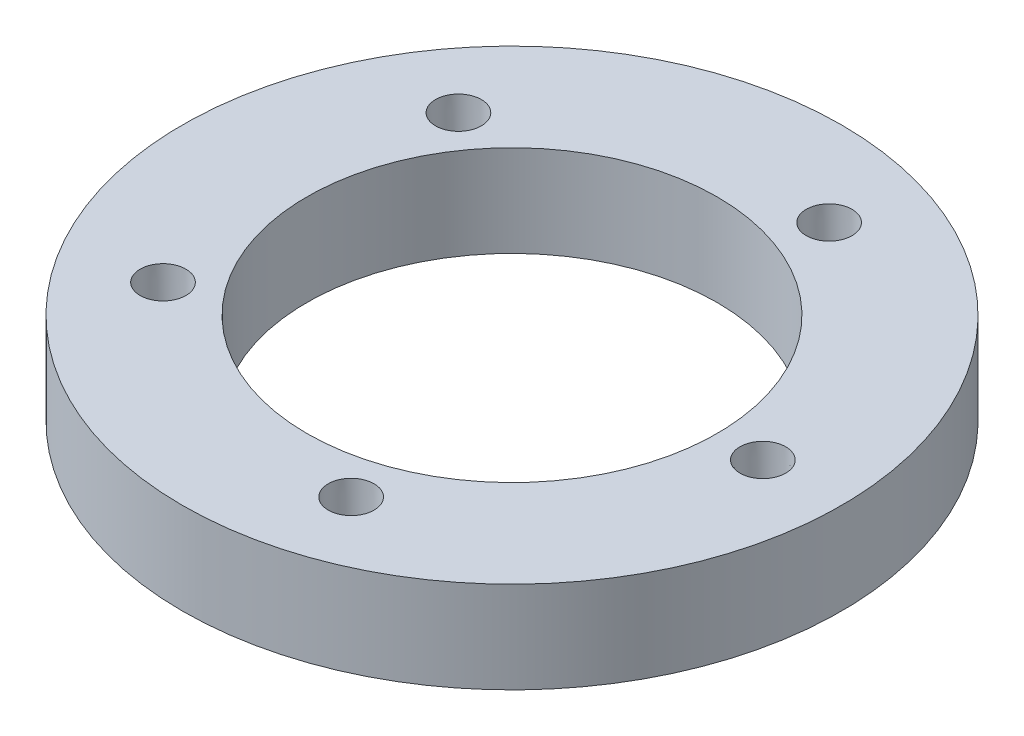
ISO-10303-21;
HEADER;
FILE_DESCRIPTION(('STEP AP214'),'2;1');
FILE_NAME('part.step','',(''),(''),'','','');
FILE_SCHEMA(('AUTOMOTIVE_DESIGN { 1 0 10303 214 1 1 1 1 }'));
ENDSEC;
DATA;
#1=APPLICATION_CONTEXT('core data for automotive mechanical design processes');
#2=APPLICATION_PROTOCOL_DEFINITION('international standard','automotive_design',2000,#1);
#3=PRODUCT_CONTEXT('',#1,'mechanical');
#4=PRODUCT('Part','Part','',(#3));
#5=PRODUCT_RELATED_PRODUCT_CATEGORY('part','',(#4));
#6=PRODUCT_DEFINITION_FORMATION('','',#4);
#7=PRODUCT_DEFINITION_CONTEXT('part definition',#1,'design');
#8=PRODUCT_DEFINITION('design','',#6,#7);
#9=PRODUCT_DEFINITION_SHAPE('','',#8);
#10=(LENGTH_UNIT() NAMED_UNIT(*) SI_UNIT(.MILLI.,.METRE.));
#11=(NAMED_UNIT(*) PLANE_ANGLE_UNIT() SI_UNIT($,.RADIAN.));
#12=(NAMED_UNIT(*) SI_UNIT($,.STERADIAN.) SOLID_ANGLE_UNIT());
#13=UNCERTAINTY_MEASURE_WITH_UNIT(LENGTH_MEASURE(1.E-05),#10,'distance_accuracy_value','');
#14=(GEOMETRIC_REPRESENTATION_CONTEXT(3) GLOBAL_UNCERTAINTY_ASSIGNED_CONTEXT((#13)) GLOBAL_UNIT_ASSIGNED_CONTEXT((#10,
#11,#12)) REPRESENTATION_CONTEXT('',''));
#15=CARTESIAN_POINT('',(0.,0.,0.));
#16=DIRECTION('',(0.,0.,1.));
#17=DIRECTION('',(1.,0.,0.));
#18=AXIS2_PLACEMENT_3D('',#15,#16,#17);
#19=CARTESIAN_POINT('',(0.,5.,0.));
#20=DIRECTION('',(0.,1.,0.));
#21=DIRECTION('',(0.,0.,1.));
#22=AXIS2_PLACEMENT_3D('',#19,#20,#21);
#23=PLANE('',#22);
#24=CARTESIAN_POINT('',(0.,5.,0.));
#25=DIRECTION('',(0.,1.,0.));
#26=DIRECTION('',(0.,0.,1.));
#27=AXIS2_PLACEMENT_3D('',#24,#25,#26);
#28=CIRCLE('',#27,18.);
#29=CARTESIAN_POINT('',(0.,5.,18.));
#30=VERTEX_POINT('',#29);
#31=EDGE_CURVE('E77',#30,#30,#28,.T.);
#32=ORIENTED_EDGE('',*,*,#31,.T.);
#33=EDGE_LOOP('',(#32));
#34=FACE_BOUND('',#33,.T.);
#35=CARTESIAN_POINT('',(0.,5.,0.));
#36=DIRECTION('',(0.,1.,0.));
#37=DIRECTION('',(0.,0.,1.));
#38=AXIS2_PLACEMENT_3D('',#35,#36,#37);
#39=CIRCLE('',#38,11.2);
#40=CARTESIAN_POINT('',(0.,5.,11.2));
#41=VERTEX_POINT('',#40);
#42=EDGE_CURVE('E10',#41,#41,#39,.T.);
#43=ORIENTED_EDGE('',*,*,#42,.F.);
#44=EDGE_LOOP('',(#43));
#45=FACE_BOUND('',#44,.T.);
#46=CARTESIAN_POINT('',(-11.0393221318819,5.,-8.11316010371688));
#47=DIRECTION('',(0.,1.,0.));
#48=DIRECTION('',(0.,0.,1.));
#49=AXIS2_PLACEMENT_3D('',#46,#47,#48);
#50=CIRCLE('',#49,1.25);
#51=CARTESIAN_POINT('',(-11.0393221318819,5.,-6.86316010371689));
#52=VERTEX_POINT('',#51);
#53=EDGE_CURVE('E49',#52,#52,#50,.T.);
#54=ORIENTED_EDGE('',*,*,#53,.F.);
#55=EDGE_LOOP('',(#54));
#56=FACE_BOUND('',#55,.T.);
#57=CARTESIAN_POINT('',(-11.0833278924611,5.,7.97772429884118));
#58=DIRECTION('',(0.,1.,0.));
#59=DIRECTION('',(0.,0.,1.));
#60=AXIS2_PLACEMENT_3D('',#57,#58,#59);
#61=CIRCLE('',#60,1.25);
#62=CARTESIAN_POINT('',(-11.0833278924611,5.,9.22772429884118));
#63=VERTEX_POINT('',#62);
#64=EDGE_CURVE('E70',#63,#63,#61,.T.);
#65=ORIENTED_EDGE('',*,*,#64,.F.);
#66=EDGE_LOOP('',(#65));
#67=FACE_BOUND('',#66,.T.);
#68=CARTESIAN_POINT('',(4.20641404367436,5.,12.9919329991078));
#69=DIRECTION('',(0.,1.,0.));
#70=DIRECTION('',(0.,0.,1.));
#71=AXIS2_PLACEMENT_3D('',#68,#69,#70);
#72=CIRCLE('',#71,1.25);
#73=CARTESIAN_POINT('',(4.20641404367436,5.,14.2419329991078));
#74=VERTEX_POINT('',#73);
#75=EDGE_CURVE('E64',#74,#74,#72,.T.);
#76=ORIENTED_EDGE('',*,*,#75,.F.);
#77=EDGE_LOOP('',(#76));
#78=FACE_BOUND('',#77,.T.);
#79=CARTESIAN_POINT('',(13.7,5.,0.));
#80=DIRECTION('',(0.,1.,0.));
#81=DIRECTION('',(0.,0.,1.));
#82=AXIS2_PLACEMENT_3D('',#79,#80,#81);
#83=CIRCLE('',#82,1.25);
#84=CARTESIAN_POINT('',(13.7,5.,1.25));
#85=VERTEX_POINT('',#84);
#86=EDGE_CURVE('E56',#85,#85,#83,.T.);
#87=ORIENTED_EDGE('',*,*,#86,.F.);
#88=EDGE_LOOP('',(#87));
#89=FACE_BOUND('',#88,.T.);
#90=CARTESIAN_POINT('',(4.27761685999241,5.,-13.0436648732767));
#91=DIRECTION('',(0.,1.,0.));
#92=DIRECTION('',(0.,0.,1.));
#93=AXIS2_PLACEMENT_3D('',#90,#91,#92);
#94=CIRCLE('',#93,1.25);
#95=CARTESIAN_POINT('',(4.27761685999241,5.,-11.7936648732767));
#96=VERTEX_POINT('',#95);
#97=EDGE_CURVE('E57',#96,#96,#94,.T.);
#98=ORIENTED_EDGE('',*,*,#97,.F.);
#99=EDGE_LOOP('',(#98));
#100=FACE_BOUND('',#99,.T.);
#101=ADVANCED_FACE('F34',(#34,#45,#56,#67,#78,#89,#100),#23,.T.);
#102=CARTESIAN_POINT('',(0.,0.,0.));
#103=DIRECTION('',(0.,1.,0.));
#104=DIRECTION('',(0.,0.,1.));
#105=AXIS2_PLACEMENT_3D('',#102,#103,#104);
#106=PLANE('',#105);
#107=CARTESIAN_POINT('',(0.,0.,0.));
#108=DIRECTION('',(0.,1.,0.));
#109=DIRECTION('',(0.,0.,1.));
#110=AXIS2_PLACEMENT_3D('',#107,#108,#109);
#111=CIRCLE('',#110,18.);
#112=CARTESIAN_POINT('',(0.,0.,18.));
#113=VERTEX_POINT('',#112);
#114=EDGE_CURVE('E60',#113,#113,#111,.F.);
#115=ORIENTED_EDGE('',*,*,#114,.T.);
#116=EDGE_LOOP('',(#115));
#117=FACE_BOUND('',#116,.T.);
#118=CARTESIAN_POINT('',(0.,0.,0.));
#119=DIRECTION('',(0.,1.,0.));
#120=DIRECTION('',(0.,0.,1.));
#121=AXIS2_PLACEMENT_3D('',#118,#119,#120);
#122=CIRCLE('',#121,11.2);
#123=CARTESIAN_POINT('',(0.,0.,11.2));
#124=VERTEX_POINT('',#123);
#125=EDGE_CURVE('E38',#124,#124,#122,.T.);
#126=ORIENTED_EDGE('',*,*,#125,.T.);
#127=EDGE_LOOP('',(#126));
#128=FACE_BOUND('',#127,.T.);
#129=CARTESIAN_POINT('',(-11.0393221318819,0.,-8.11316010371688));
#130=DIRECTION('',(0.,1.,0.));
#131=DIRECTION('',(0.,0.,1.));
#132=AXIS2_PLACEMENT_3D('',#129,#130,#131);
#133=CIRCLE('',#132,1.07539615254126);
#134=CARTESIAN_POINT('',(-11.0393221318819,0.,-7.03776395117563));
#135=VERTEX_POINT('',#134);
#136=EDGE_CURVE('E45',#135,#135,#133,.T.);
#137=ORIENTED_EDGE('',*,*,#136,.T.);
#138=EDGE_LOOP('',(#137));
#139=FACE_BOUND('',#138,.T.);
#140=CARTESIAN_POINT('',(-11.0833278924611,0.,7.97772429884118));
#141=DIRECTION('',(0.,1.,0.));
#142=DIRECTION('',(0.,0.,1.));
#143=AXIS2_PLACEMENT_3D('',#140,#141,#142);
#144=CIRCLE('',#143,1.07539615254126);
#145=CARTESIAN_POINT('',(-11.0833278924611,0.,9.05312045138244));
#146=VERTEX_POINT('',#145);
#147=EDGE_CURVE('E52',#146,#146,#144,.T.);
#148=ORIENTED_EDGE('',*,*,#147,.T.);
#149=EDGE_LOOP('',(#148));
#150=FACE_BOUND('',#149,.T.);
#151=CARTESIAN_POINT('',(4.20641404367436,0.,12.9919329991078));
#152=DIRECTION('',(0.,1.,0.));
#153=DIRECTION('',(0.,0.,1.));
#154=AXIS2_PLACEMENT_3D('',#151,#152,#153);
#155=CIRCLE('',#154,1.07539615254126);
#156=CARTESIAN_POINT('',(4.20641404367436,0.,14.0673291516491));
#157=VERTEX_POINT('',#156);
#158=EDGE_CURVE('E67',#157,#157,#155,.T.);
#159=ORIENTED_EDGE('',*,*,#158,.T.);
#160=EDGE_LOOP('',(#159));
#161=FACE_BOUND('',#160,.T.);
#162=CARTESIAN_POINT('',(13.7,0.,0.));
#163=DIRECTION('',(0.,1.,0.));
#164=DIRECTION('',(0.,0.,1.));
#165=AXIS2_PLACEMENT_3D('',#162,#163,#164);
#166=CIRCLE('',#165,1.07539615254126);
#167=CARTESIAN_POINT('',(13.7,0.,1.07539615254126));
#168=VERTEX_POINT('',#167);
#169=EDGE_CURVE('E61',#168,#168,#166,.T.);
#170=ORIENTED_EDGE('',*,*,#169,.T.);
#171=EDGE_LOOP('',(#170));
#172=FACE_BOUND('',#171,.T.);
#173=CARTESIAN_POINT('',(4.27761685999241,0.,-13.0436648732767));
#174=DIRECTION('',(0.,1.,0.));
#175=DIRECTION('',(0.,0.,1.));
#176=AXIS2_PLACEMENT_3D('',#173,#174,#175);
#177=CIRCLE('',#176,1.07539615254126);
#178=CARTESIAN_POINT('',(4.27761685999241,0.,-11.9682687207354));
#179=VERTEX_POINT('',#178);
#180=EDGE_CURVE('E53',#179,#179,#177,.T.);
#181=ORIENTED_EDGE('',*,*,#180,.T.);
#182=EDGE_LOOP('',(#181));
#183=FACE_BOUND('',#182,.T.);
#184=ADVANCED_FACE('F36',(#117,#128,#139,#150,#161,#172,#183),#106,.F.);
#185=CARTESIAN_POINT('',(0.,5.,0.));
#186=DIRECTION('',(0.,-1.,0.));
#187=DIRECTION('',(0.,0.,-1.));
#188=AXIS2_PLACEMENT_3D('',#185,#186,#187);
#189=CYLINDRICAL_SURFACE('',#188,11.2);
#190=ORIENTED_EDGE('',*,*,#42,.T.);
#191=EDGE_LOOP('',(#190));
#192=FACE_BOUND('',#191,.T.);
#193=ORIENTED_EDGE('',*,*,#125,.F.);
#194=EDGE_LOOP('',(#193));
#195=FACE_BOUND('',#194,.T.);
#196=ADVANCED_FACE('F122',(#192,#195),#189,.F.);
#197=CARTESIAN_POINT('',(-11.0393221318819,5.,-8.11316010371688));
#198=DIRECTION('',(0.,1.,0.));
#199=DIRECTION('',(0.,0.,1.));
#200=AXIS2_PLACEMENT_3D('',#197,#198,#199);
#201=CONICAL_SURFACE('',#200,1.25,0.0349065850398867);
#202=ORIENTED_EDGE('',*,*,#136,.F.);
#203=EDGE_LOOP('',(#202));
#204=FACE_BOUND('',#203,.T.);
#205=ORIENTED_EDGE('',*,*,#53,.T.);
#206=EDGE_LOOP('',(#205));
#207=FACE_BOUND('',#206,.T.);
#208=ADVANCED_FACE('F118',(#204,#207),#201,.F.);
#209=CARTESIAN_POINT('',(-11.0833278924611,5.,7.97772429884118));
#210=DIRECTION('',(0.,1.,0.));
#211=DIRECTION('',(0.,0.,1.));
#212=AXIS2_PLACEMENT_3D('',#209,#210,#211);
#213=CONICAL_SURFACE('',#212,1.25,0.0349065850398867);
#214=ORIENTED_EDGE('',*,*,#147,.F.);
#215=EDGE_LOOP('',(#214));
#216=FACE_BOUND('',#215,.T.);
#217=ORIENTED_EDGE('',*,*,#64,.T.);
#218=EDGE_LOOP('',(#217));
#219=FACE_BOUND('',#218,.T.);
#220=ADVANCED_FACE('F121',(#216,#219),#213,.F.);
#221=CARTESIAN_POINT('',(4.20641404367436,5.,12.9919329991078));
#222=DIRECTION('',(0.,1.,0.));
#223=DIRECTION('',(0.,0.,1.));
#224=AXIS2_PLACEMENT_3D('',#221,#222,#223);
#225=CONICAL_SURFACE('',#224,1.25,0.0349065850398867);
#226=ORIENTED_EDGE('',*,*,#158,.F.);
#227=EDGE_LOOP('',(#226));
#228=FACE_BOUND('',#227,.T.);
#229=ORIENTED_EDGE('',*,*,#75,.T.);
#230=EDGE_LOOP('',(#229));
#231=FACE_BOUND('',#230,.T.);
#232=ADVANCED_FACE('F112',(#228,#231),#225,.F.);
#233=CARTESIAN_POINT('',(13.7,5.,0.));
#234=DIRECTION('',(0.,1.,0.));
#235=DIRECTION('',(0.,0.,1.));
#236=AXIS2_PLACEMENT_3D('',#233,#234,#235);
#237=CONICAL_SURFACE('',#236,1.25,0.0349065850398867);
#238=ORIENTED_EDGE('',*,*,#169,.F.);
#239=EDGE_LOOP('',(#238));
#240=FACE_BOUND('',#239,.T.);
#241=ORIENTED_EDGE('',*,*,#86,.T.);
#242=EDGE_LOOP('',(#241));
#243=FACE_BOUND('',#242,.T.);
#244=ADVANCED_FACE('F106',(#240,#243),#237,.F.);
#245=CARTESIAN_POINT('',(4.27761685999241,5.,-13.0436648732767));
#246=DIRECTION('',(0.,1.,0.));
#247=DIRECTION('',(0.,0.,1.));
#248=AXIS2_PLACEMENT_3D('',#245,#246,#247);
#249=CONICAL_SURFACE('',#248,1.25,0.0349065850398867);
#250=ORIENTED_EDGE('',*,*,#180,.F.);
#251=EDGE_LOOP('',(#250));
#252=FACE_BOUND('',#251,.T.);
#253=ORIENTED_EDGE('',*,*,#97,.T.);
#254=EDGE_LOOP('',(#253));
#255=FACE_BOUND('',#254,.T.);
#256=ADVANCED_FACE('F88',(#252,#255),#249,.F.);
#257=CARTESIAN_POINT('',(0.,-50.9116882454314,0.));
#258=DIRECTION('',(0.,1.,0.));
#259=DIRECTION('',(0.,0.,1.));
#260=AXIS2_PLACEMENT_3D('',#257,#258,#259);
#261=CYLINDRICAL_SURFACE('',#260,18.);
#262=ORIENTED_EDGE('',*,*,#114,.F.);
#263=EDGE_LOOP('',(#262));
#264=FACE_BOUND('',#263,.T.);
#265=ORIENTED_EDGE('',*,*,#31,.F.);
#266=EDGE_LOOP('',(#265));
#267=FACE_BOUND('',#266,.T.);
#268=ADVANCED_FACE('F85',(#264,#267),#261,.T.);
#269=CLOSED_SHELL('',(#101,#184,#196,#208,#220,#232,#244,#256,#268));
#270=MANIFOLD_SOLID_BREP('B2',#269);
#271=ADVANCED_BREP_SHAPE_REPRESENTATION('',(#18,#270),#14);
#272=SHAPE_DEFINITION_REPRESENTATION(#9,#271);
ENDSEC;
END-ISO-10303-21;
